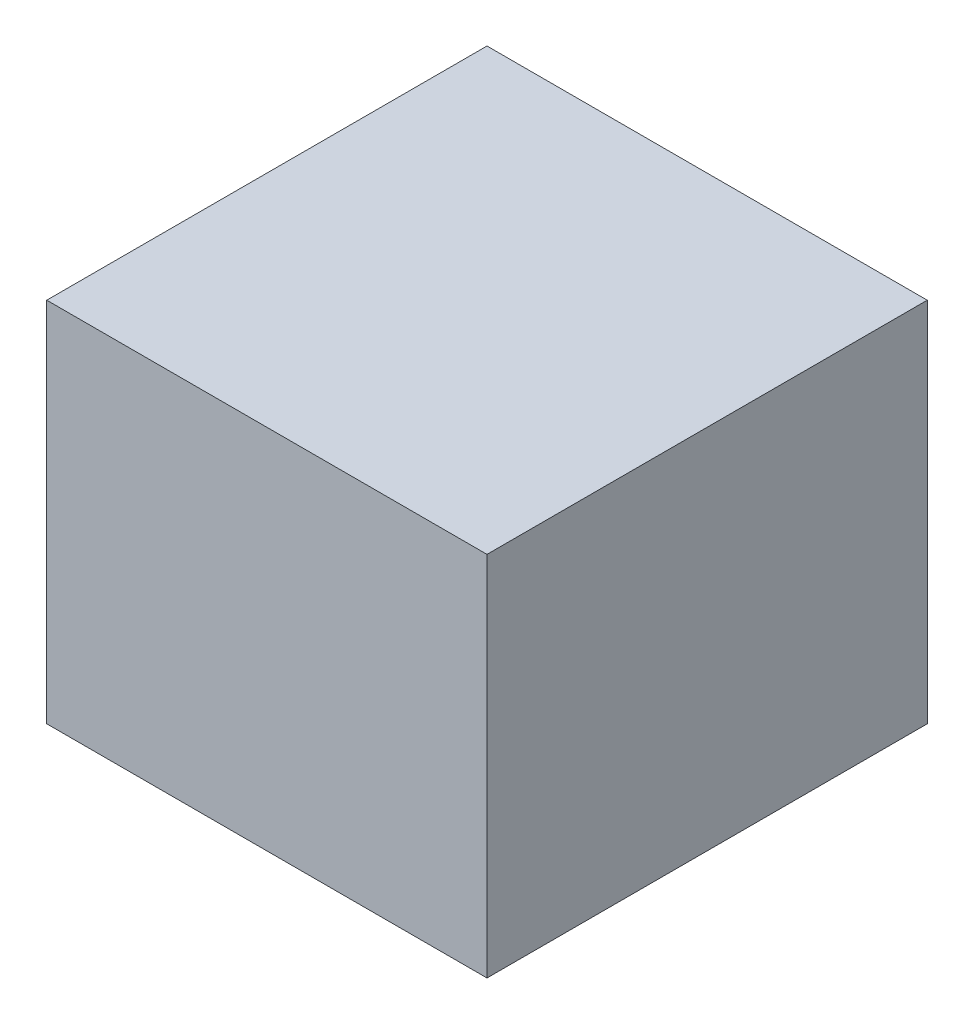
ISO-10303-21;
HEADER;
FILE_DESCRIPTION(('STEP AP214'),'2;1');
FILE_NAME('part.step','',(''),(''),'','','');
FILE_SCHEMA(('AUTOMOTIVE_DESIGN { 1 0 10303 214 1 1 1 1 }'));
ENDSEC;
DATA;
#1=APPLICATION_CONTEXT('core data for automotive mechanical design processes');
#2=APPLICATION_PROTOCOL_DEFINITION('international standard','automotive_design',2000,#1);
#3=PRODUCT_CONTEXT('',#1,'mechanical');
#4=PRODUCT('Part','Part','',(#3));
#5=PRODUCT_RELATED_PRODUCT_CATEGORY('part','',(#4));
#6=PRODUCT_DEFINITION_FORMATION('','',#4);
#7=PRODUCT_DEFINITION_CONTEXT('part definition',#1,'design');
#8=PRODUCT_DEFINITION('design','',#6,#7);
#9=PRODUCT_DEFINITION_SHAPE('','',#8);
#10=(LENGTH_UNIT() NAMED_UNIT(*) SI_UNIT(.MILLI.,.METRE.));
#11=(NAMED_UNIT(*) PLANE_ANGLE_UNIT() SI_UNIT($,.RADIAN.));
#12=(NAMED_UNIT(*) SI_UNIT($,.STERADIAN.) SOLID_ANGLE_UNIT());
#13=UNCERTAINTY_MEASURE_WITH_UNIT(LENGTH_MEASURE(1.E-05),#10,'distance_accuracy_value','');
#14=(GEOMETRIC_REPRESENTATION_CONTEXT(3) GLOBAL_UNCERTAINTY_ASSIGNED_CONTEXT((#13)) GLOBAL_UNIT_ASSIGNED_CONTEXT((#10,
#11,#12)) REPRESENTATION_CONTEXT('',''));
#15=CARTESIAN_POINT('',(0.,0.,0.));
#16=DIRECTION('',(0.,0.,1.));
#17=DIRECTION('',(1.,0.,0.));
#18=AXIS2_PLACEMENT_3D('',#15,#16,#17);
#19=CARTESIAN_POINT('',(0.,0.,76.2));
#20=DIRECTION('',(1.,0.,0.));
#21=DIRECTION('',(0.,0.,-1.));
#22=AXIS2_PLACEMENT_3D('',#19,#20,#21);
#23=PLANE('',#22);
#24=DIRECTION('',(0.,-1.,0.));
#25=VECTOR('',#24,1.);
#26=CARTESIAN_POINT('',(0.,0.,0.));
#27=LINE('',#26,#25);
#28=CARTESIAN_POINT('',(0.,63.5,0.));
#29=VERTEX_POINT('',#28);
#30=CARTESIAN_POINT('',(0.,0.,0.));
#31=VERTEX_POINT('',#30);
#32=EDGE_CURVE('E97',#29,#31,#27,.T.);
#33=ORIENTED_EDGE('',*,*,#32,.T.);
#34=DIRECTION('',(0.,0.,-1.));
#35=VECTOR('',#34,1.);
#36=CARTESIAN_POINT('',(0.,0.,76.2));
#37=LINE('',#36,#35);
#38=CARTESIAN_POINT('',(0.,0.,76.2));
#39=VERTEX_POINT('',#38);
#40=EDGE_CURVE('E11',#39,#31,#37,.T.);
#41=ORIENTED_EDGE('',*,*,#40,.F.);
#42=DIRECTION('',(0.,-1.,0.));
#43=VECTOR('',#42,1.);
#44=CARTESIAN_POINT('',(0.,0.,76.2));
#45=LINE('',#44,#43);
#46=CARTESIAN_POINT('',(0.,63.5,76.2));
#47=VERTEX_POINT('',#46);
#48=EDGE_CURVE('E85',#47,#39,#45,.T.);
#49=ORIENTED_EDGE('',*,*,#48,.F.);
#50=DIRECTION('',(0.,0.,-1.));
#51=VECTOR('',#50,1.);
#52=CARTESIAN_POINT('',(0.,63.5,76.2));
#53=LINE('',#52,#51);
#54=EDGE_CURVE('E93',#47,#29,#53,.T.);
#55=ORIENTED_EDGE('',*,*,#54,.T.);
#56=EDGE_LOOP('',(#33,#41,#49,#55));
#57=FACE_BOUND('',#56,.T.);
#58=ADVANCED_FACE('F34',(#57),#23,.F.);
#59=CARTESIAN_POINT('',(0.,0.,76.2));
#60=DIRECTION('',(0.,1.,0.));
#61=DIRECTION('',(0.,0.,1.));
#62=AXIS2_PLACEMENT_3D('',#59,#60,#61);
#63=PLANE('',#62);
#64=DIRECTION('',(1.,0.,0.));
#65=VECTOR('',#64,1.);
#66=CARTESIAN_POINT('',(0.,0.,0.));
#67=LINE('',#66,#65);
#68=CARTESIAN_POINT('',(76.2,0.,0.));
#69=VERTEX_POINT('',#68);
#70=EDGE_CURVE('E89',#31,#69,#67,.T.);
#71=ORIENTED_EDGE('',*,*,#70,.T.);
#72=DIRECTION('',(0.,0.,-1.));
#73=VECTOR('',#72,1.);
#74=CARTESIAN_POINT('',(76.2,0.,76.2));
#75=LINE('',#74,#73);
#76=CARTESIAN_POINT('',(76.2,0.,76.2));
#77=VERTEX_POINT('',#76);
#78=EDGE_CURVE('E42',#77,#69,#75,.T.);
#79=ORIENTED_EDGE('',*,*,#78,.F.);
#80=DIRECTION('',(1.,0.,0.));
#81=VECTOR('',#80,1.);
#82=CARTESIAN_POINT('',(0.,0.,76.2));
#83=LINE('',#82,#81);
#84=EDGE_CURVE('E80',#39,#77,#83,.T.);
#85=ORIENTED_EDGE('',*,*,#84,.F.);
#86=ORIENTED_EDGE('',*,*,#40,.T.);
#87=EDGE_LOOP('',(#71,#79,#85,#86));
#88=FACE_BOUND('',#87,.T.);
#89=ADVANCED_FACE('F88',(#88),#63,.F.);
#90=CARTESIAN_POINT('',(76.2,0.,76.2));
#91=DIRECTION('',(-1.,0.,0.));
#92=DIRECTION('',(0.,0.,1.));
#93=AXIS2_PLACEMENT_3D('',#90,#91,#92);
#94=PLANE('',#93);
#95=DIRECTION('',(0.,1.,0.));
#96=VECTOR('',#95,1.);
#97=CARTESIAN_POINT('',(76.2,0.,0.));
#98=LINE('',#97,#96);
#99=CARTESIAN_POINT('',(76.2,63.5,0.));
#100=VERTEX_POINT('',#99);
#101=EDGE_CURVE('E67',#69,#100,#98,.T.);
#102=ORIENTED_EDGE('',*,*,#101,.T.);
#103=DIRECTION('',(0.,0.,-1.));
#104=VECTOR('',#103,1.);
#105=CARTESIAN_POINT('',(76.2,63.5,76.2));
#106=LINE('',#105,#104);
#107=CARTESIAN_POINT('',(76.2,63.5,76.2));
#108=VERTEX_POINT('',#107);
#109=EDGE_CURVE('E90',#108,#100,#106,.T.);
#110=ORIENTED_EDGE('',*,*,#109,.F.);
#111=DIRECTION('',(0.,1.,0.));
#112=VECTOR('',#111,1.);
#113=CARTESIAN_POINT('',(76.2,0.,76.2));
#114=LINE('',#113,#112);
#115=EDGE_CURVE('E83',#77,#108,#114,.T.);
#116=ORIENTED_EDGE('',*,*,#115,.F.);
#117=ORIENTED_EDGE('',*,*,#78,.T.);
#118=EDGE_LOOP('',(#102,#110,#116,#117));
#119=FACE_BOUND('',#118,.T.);
#120=ADVANCED_FACE('F91',(#119),#94,.F.);
#121=CARTESIAN_POINT('',(0.,63.5,76.2));
#122=DIRECTION('',(0.,-1.,0.));
#123=DIRECTION('',(0.,0.,-1.));
#124=AXIS2_PLACEMENT_3D('',#121,#122,#123);
#125=PLANE('',#124);
#126=DIRECTION('',(-1.,0.,0.));
#127=VECTOR('',#126,1.);
#128=CARTESIAN_POINT('',(0.,63.5,0.));
#129=LINE('',#128,#127);
#130=EDGE_CURVE('E73',#100,#29,#129,.T.);
#131=ORIENTED_EDGE('',*,*,#130,.T.);
#132=ORIENTED_EDGE('',*,*,#54,.F.);
#133=DIRECTION('',(-1.,0.,0.));
#134=VECTOR('',#133,1.);
#135=CARTESIAN_POINT('',(0.,63.5,76.2));
#136=LINE('',#135,#134);
#137=EDGE_CURVE('E50',#108,#47,#136,.T.);
#138=ORIENTED_EDGE('',*,*,#137,.F.);
#139=ORIENTED_EDGE('',*,*,#109,.T.);
#140=EDGE_LOOP('',(#131,#132,#138,#139));
#141=FACE_BOUND('',#140,.T.);
#142=ADVANCED_FACE('F104',(#141),#125,.F.);
#143=CARTESIAN_POINT('',(0.,0.,76.2));
#144=DIRECTION('',(0.,0.,-1.));
#145=DIRECTION('',(-1.,0.,0.));
#146=AXIS2_PLACEMENT_3D('',#143,#144,#145);
#147=PLANE('',#146);
#148=ORIENTED_EDGE('',*,*,#48,.T.);
#149=ORIENTED_EDGE('',*,*,#84,.T.);
#150=ORIENTED_EDGE('',*,*,#115,.T.);
#151=ORIENTED_EDGE('',*,*,#137,.T.);
#152=EDGE_LOOP('',(#148,#149,#150,#151));
#153=FACE_BOUND('',#152,.T.);
#154=ADVANCED_FACE('F81',(#153),#147,.F.);
#155=CARTESIAN_POINT('',(0.,0.,0.));
#156=DIRECTION('',(0.,0.,-1.));
#157=DIRECTION('',(-1.,0.,0.));
#158=AXIS2_PLACEMENT_3D('',#155,#156,#157);
#159=PLANE('',#158);
#160=ORIENTED_EDGE('',*,*,#32,.F.);
#161=ORIENTED_EDGE('',*,*,#130,.F.);
#162=ORIENTED_EDGE('',*,*,#101,.F.);
#163=ORIENTED_EDGE('',*,*,#70,.F.);
#164=EDGE_LOOP('',(#160,#161,#162,#163));
#165=FACE_BOUND('',#164,.T.);
#166=ADVANCED_FACE('F107',(#165),#159,.T.);
#167=CLOSED_SHELL('',(#58,#89,#120,#142,#154,#166));
#168=MANIFOLD_SOLID_BREP('B2',#167);
#169=ADVANCED_BREP_SHAPE_REPRESENTATION('',(#18,#168),#14);
#170=SHAPE_DEFINITION_REPRESENTATION(#9,#169);
ENDSEC;
END-ISO-10303-21;
